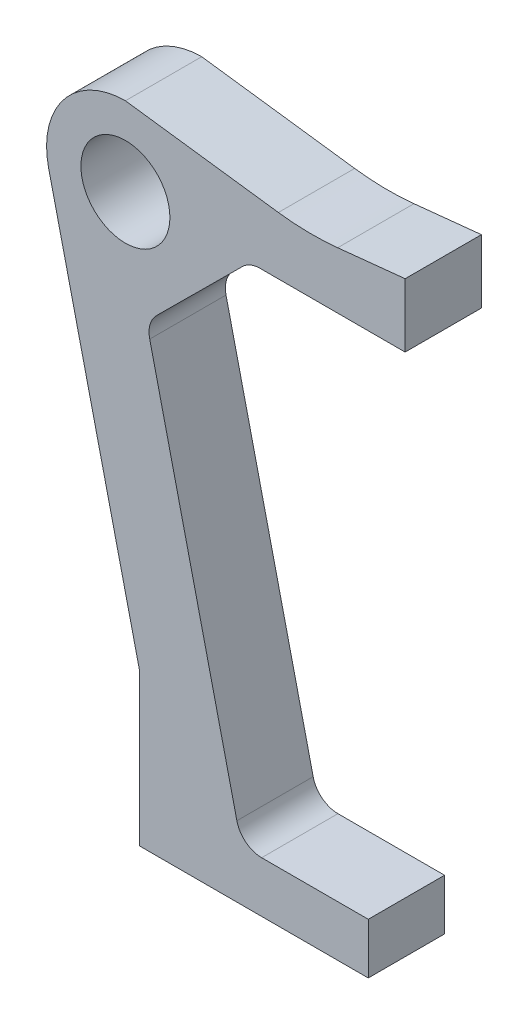
ISO-10303-21;
HEADER;
FILE_DESCRIPTION(('STEP AP214'),'2;1');
FILE_NAME('part.step','',(''),(''),'','','');
FILE_SCHEMA(('AUTOMOTIVE_DESIGN { 1 0 10303 214 1 1 1 1 }'));
ENDSEC;
DATA;
#1=APPLICATION_CONTEXT('core data for automotive mechanical design processes');
#2=APPLICATION_PROTOCOL_DEFINITION('international standard','automotive_design',2000,#1);
#3=PRODUCT_CONTEXT('',#1,'mechanical');
#4=PRODUCT('Part','Part','',(#3));
#5=PRODUCT_RELATED_PRODUCT_CATEGORY('part','',(#4));
#6=PRODUCT_DEFINITION_FORMATION('','',#4);
#7=PRODUCT_DEFINITION_CONTEXT('part definition',#1,'design');
#8=PRODUCT_DEFINITION('design','',#6,#7);
#9=PRODUCT_DEFINITION_SHAPE('','',#8);
#10=(LENGTH_UNIT() NAMED_UNIT(*) SI_UNIT(.MILLI.,.METRE.));
#11=(NAMED_UNIT(*) PLANE_ANGLE_UNIT() SI_UNIT($,.RADIAN.));
#12=(NAMED_UNIT(*) SI_UNIT($,.STERADIAN.) SOLID_ANGLE_UNIT());
#13=UNCERTAINTY_MEASURE_WITH_UNIT(LENGTH_MEASURE(1.E-05),#10,'distance_accuracy_value','');
#14=(GEOMETRIC_REPRESENTATION_CONTEXT(3) GLOBAL_UNCERTAINTY_ASSIGNED_CONTEXT((#13)) GLOBAL_UNIT_ASSIGNED_CONTEXT((#10,
#11,#12)) REPRESENTATION_CONTEXT('',''));
#15=CARTESIAN_POINT('',(0.,0.,0.));
#16=DIRECTION('',(0.,0.,1.));
#17=DIRECTION('',(1.,0.,0.));
#18=AXIS2_PLACEMENT_3D('',#15,#16,#17);
#19=CARTESIAN_POINT('',(9.357429757377,-4.925,3.2));
#20=DIRECTION('',(0.,0.,-1.));
#21=DIRECTION('',(-1.,0.,0.));
#22=AXIS2_PLACEMENT_3D('',#19,#20,#21);
#23=PLANE('',#22);
#24=DIRECTION('',(0.,-1.,0.));
#25=VECTOR('',#24,1.);
#26=CARTESIAN_POINT('',(4.55,-1.925,3.2));
#27=LINE('',#26,#25);
#28=CARTESIAN_POINT('',(4.55,-1.925,3.2));
#29=VERTEX_POINT('',#28);
#30=CARTESIAN_POINT('',(4.55000000000001,-7.925,3.2));
#31=VERTEX_POINT('',#30);
#32=EDGE_CURVE('E215',#29,#31,#27,.T.);
#33=ORIENTED_EDGE('',*,*,#32,.T.);
#34=DIRECTION('',(1.,0.,0.));
#35=VECTOR('',#34,1.);
#36=CARTESIAN_POINT('',(4.55000000000001,-7.925,3.2));
#37=LINE('',#36,#35);
#38=CARTESIAN_POINT('',(13.55,-7.925,3.2));
#39=VERTEX_POINT('',#38);
#40=EDGE_CURVE('E123',#31,#39,#37,.T.);
#41=ORIENTED_EDGE('',*,*,#40,.T.);
#42=DIRECTION('',(0.,1.,0.));
#43=VECTOR('',#42,1.);
#44=CARTESIAN_POINT('',(13.55,-7.925,3.2));
#45=LINE('',#44,#43);
#46=CARTESIAN_POINT('',(13.55,-5.925,3.2));
#47=VERTEX_POINT('',#46);
#48=EDGE_CURVE('E254',#39,#47,#45,.T.);
#49=ORIENTED_EDGE('',*,*,#48,.T.);
#50=DIRECTION('',(-1.,0.,0.));
#51=VECTOR('',#50,1.);
#52=CARTESIAN_POINT('',(13.55,-5.925,3.2));
#53=LINE('',#52,#51);
#54=CARTESIAN_POINT('',(9.357429757377,-5.925,3.2));
#55=VERTEX_POINT('',#54);
#56=EDGE_CURVE('E273',#47,#55,#53,.T.);
#57=ORIENTED_EDGE('',*,*,#56,.T.);
#58=CARTESIAN_POINT('',(9.357429757377,-4.925,3.2));
#59=DIRECTION('',(0.,0.,-1.));
#60=DIRECTION('',(-1.,0.,0.));
#61=AXIS2_PLACEMENT_3D('',#58,#59,#60);
#62=CIRCLE('',#61,1.);
#63=CARTESIAN_POINT('',(8.38358766247106,-5.15222582201239,3.2));
#64=VERTEX_POINT('',#63);
#65=EDGE_CURVE('E270',#55,#64,#62,.T.);
#66=ORIENTED_EDGE('',*,*,#65,.T.);
#67=DIRECTION('',(-0.227225822012392,0.973842094905941,0.));
#68=VECTOR('',#67,1.);
#69=CARTESIAN_POINT('',(8.38358766247106,-5.15222582201239,3.2));
#70=LINE('',#69,#68);
#71=CARTESIAN_POINT('',(4.95620251262334,9.5368262620205,3.2));
#72=VERTEX_POINT('',#71);
#73=EDGE_CURVE('E272',#64,#72,#70,.T.);
#74=ORIENTED_EDGE('',*,*,#73,.T.);
#75=CARTESIAN_POINT('',(5.93004460752928,9.76405208403289,3.2));
#76=DIRECTION('',(0.,0.,-1.));
#77=DIRECTION('',(-1.,0.,0.));
#78=AXIS2_PLACEMENT_3D('',#75,#76,#77);
#79=CIRCLE('',#78,1.);
#80=CARTESIAN_POINT('',(5.22498709725014,10.4732022142585,3.2));
#81=VERTEX_POINT('',#80);
#82=EDGE_CURVE('E275',#72,#81,#79,.T.);
#83=ORIENTED_EDGE('',*,*,#82,.T.);
#84=DIRECTION('',(0.709150130225592,0.705057510279145,0.));
#85=VECTOR('',#84,1.);
#86=CARTESIAN_POINT('',(5.22498709725014,10.4732022142585,3.2));
#87=LINE('',#86,#85);
#88=CARTESIAN_POINT('',(8.59600284324305,13.8247632838806,3.2));
#89=VERTEX_POINT('',#88);
#90=EDGE_CURVE('E281',#81,#89,#87,.T.);
#91=ORIENTED_EDGE('',*,*,#90,.T.);
#92=CARTESIAN_POINT('',(9.3010603535222,13.115613153655,3.2));
#93=DIRECTION('',(0.,0.,-1.));
#94=DIRECTION('',(1.,0.,0.));
#95=AXIS2_PLACEMENT_3D('',#92,#93,#94);
#96=CIRCLE('',#95,1.);
#97=CARTESIAN_POINT('',(9.3010603535222,14.115613153655,3.2));
#98=VERTEX_POINT('',#97);
#99=EDGE_CURVE('E283',#89,#98,#96,.T.);
#100=ORIENTED_EDGE('',*,*,#99,.T.);
#101=DIRECTION('',(1.,0.,0.));
#102=VECTOR('',#101,1.);
#103=CARTESIAN_POINT('',(15.,14.115613153655,3.2));
#104=LINE('',#103,#102);
#105=CARTESIAN_POINT('',(15.,14.115613153655,3.2));
#106=VERTEX_POINT('',#105);
#107=EDGE_CURVE('E285',#98,#106,#104,.T.);
#108=ORIENTED_EDGE('',*,*,#107,.T.);
#109=DIRECTION('',(0.,1.,0.));
#110=VECTOR('',#109,1.);
#111=CARTESIAN_POINT('',(15.,16.615613153655,3.2));
#112=LINE('',#111,#110);
#113=CARTESIAN_POINT('',(15.,16.615613153655,3.2));
#114=VERTEX_POINT('',#113);
#115=EDGE_CURVE('E287',#106,#114,#112,.T.);
#116=ORIENTED_EDGE('',*,*,#115,.T.);
#117=DIRECTION('',(-0.994790734183145,-0.101938192957101,0.));
#118=VECTOR('',#117,1.);
#119=CARTESIAN_POINT('',(15.,16.615613153655,3.2));
#120=LINE('',#119,#118);
#121=CARTESIAN_POINT('',(12.3474469478221,16.3438007457078,3.2));
#122=VERTEX_POINT('',#121);
#123=EDGE_CURVE('E289',#114,#122,#120,.T.);
#124=ORIENTED_EDGE('',*,*,#123,.T.);
#125=CARTESIAN_POINT('',(11.3280650182511,26.2917080875393,3.2));
#126=DIRECTION('',(0.,0.,-1.));
#127=DIRECTION('',(-1.,0.,0.));
#128=AXIS2_PLACEMENT_3D('',#125,#126,#127);
#129=CIRCLE('',#128,10.);
#130=CARTESIAN_POINT('',(10.0149943856032,16.3782906387642,3.2));
#131=VERTEX_POINT('',#130);
#132=EDGE_CURVE('E166',#122,#131,#129,.T.);
#133=ORIENTED_EDGE('',*,*,#132,.T.);
#134=DIRECTION('',(-0.991341744877506,0.131307063264781,0.));
#135=VECTOR('',#134,1.);
#136=CARTESIAN_POINT('',(4.,17.175,3.2));
#137=LINE('',#136,#135);
#138=CARTESIAN_POINT('',(4.,17.175,3.2));
#139=VERTEX_POINT('',#138);
#140=EDGE_CURVE('E160',#131,#139,#137,.T.);
#141=ORIENTED_EDGE('',*,*,#140,.T.);
#142=CARTESIAN_POINT('',(4.,14.075,3.2));
#143=DIRECTION('',(0.,0.,1.));
#144=DIRECTION('',(1.,0.,0.));
#145=AXIS2_PLACEMENT_3D('',#142,#143,#144);
#146=CIRCLE('',#145,3.1);
#147=CARTESIAN_POINT('',(0.981089505791579,13.3705999517616,3.2));
#148=VERTEX_POINT('',#147);
#149=EDGE_CURVE('E164',#139,#148,#146,.T.);
#150=ORIENTED_EDGE('',*,*,#149,.T.);
#151=DIRECTION('',(0.227225822012392,-0.973842094905941,0.));
#152=VECTOR('',#151,1.);
#153=CARTESIAN_POINT('',(0.981089505791579,13.3705999517616,3.2));
#154=LINE('',#153,#152);
#155=EDGE_CURVE('E56',#148,#29,#154,.T.);
#156=ORIENTED_EDGE('',*,*,#155,.T.);
#157=EDGE_LOOP('',(#33,#41,#49,#57,#66,#74,#83,#91,#100,#108,#116,#124,#133,#141,#150,#156));
#158=FACE_BOUND('',#157,.T.);
#159=CARTESIAN_POINT('',(4.,14.075,3.2));
#160=DIRECTION('',(0.,0.,1.));
#161=DIRECTION('',(1.,0.,0.));
#162=AXIS2_PLACEMENT_3D('',#159,#160,#161);
#163=CIRCLE('',#162,1.75);
#164=CARTESIAN_POINT('',(5.75,14.075,3.2));
#165=VERTEX_POINT('',#164);
#166=EDGE_CURVE('E188',#165,#165,#163,.T.);
#167=ORIENTED_EDGE('',*,*,#166,.F.);
#168=EDGE_LOOP('',(#167));
#169=FACE_BOUND('',#168,.T.);
#170=ADVANCED_FACE('F39',(#158,#169),#23,.F.);
#171=CARTESIAN_POINT('',(9.357429757377,-4.925,0.2));
#172=DIRECTION('',(0.,0.,-1.));
#173=DIRECTION('',(-1.,0.,0.));
#174=AXIS2_PLACEMENT_3D('',#171,#172,#173);
#175=PLANE('',#174);
#176=DIRECTION('',(0.,-1.,0.));
#177=VECTOR('',#176,1.);
#178=CARTESIAN_POINT('',(4.55,-1.925,0.2));
#179=LINE('',#178,#177);
#180=CARTESIAN_POINT('',(4.55,-1.925,0.2));
#181=VERTEX_POINT('',#180);
#182=CARTESIAN_POINT('',(4.55000000000001,-7.925,0.2));
#183=VERTEX_POINT('',#182);
#184=EDGE_CURVE('E184',#181,#183,#179,.T.);
#185=ORIENTED_EDGE('',*,*,#184,.F.);
#186=DIRECTION('',(0.227225822012392,-0.973842094905941,0.));
#187=VECTOR('',#186,1.);
#188=CARTESIAN_POINT('',(0.981089505791579,13.3705999517616,0.2));
#189=LINE('',#188,#187);
#190=CARTESIAN_POINT('',(0.981089505791579,13.3705999517616,0.2));
#191=VERTEX_POINT('',#190);
#192=EDGE_CURVE('E115',#191,#181,#189,.T.);
#193=ORIENTED_EDGE('',*,*,#192,.F.);
#194=CARTESIAN_POINT('',(4.,14.075,0.2));
#195=DIRECTION('',(0.,0.,1.));
#196=DIRECTION('',(1.,0.,0.));
#197=AXIS2_PLACEMENT_3D('',#194,#195,#196);
#198=CIRCLE('',#197,3.1);
#199=CARTESIAN_POINT('',(4.,17.175,0.2));
#200=VERTEX_POINT('',#199);
#201=EDGE_CURVE('E109',#200,#191,#198,.T.);
#202=ORIENTED_EDGE('',*,*,#201,.F.);
#203=DIRECTION('',(-0.991341744877506,0.131307063264781,0.));
#204=VECTOR('',#203,1.);
#205=CARTESIAN_POINT('',(4.,17.175,0.2));
#206=LINE('',#205,#204);
#207=CARTESIAN_POINT('',(10.0149943856032,16.3782906387642,0.2));
#208=VERTEX_POINT('',#207);
#209=EDGE_CURVE('E174',#208,#200,#206,.T.);
#210=ORIENTED_EDGE('',*,*,#209,.F.);
#211=CARTESIAN_POINT('',(11.3280650182511,26.2917080875393,0.2));
#212=DIRECTION('',(0.,0.,-1.));
#213=DIRECTION('',(-1.,0.,0.));
#214=AXIS2_PLACEMENT_3D('',#211,#212,#213);
#215=CIRCLE('',#214,10.);
#216=CARTESIAN_POINT('',(12.3474469478221,16.3438007457078,0.2));
#217=VERTEX_POINT('',#216);
#218=EDGE_CURVE('E210',#217,#208,#215,.T.);
#219=ORIENTED_EDGE('',*,*,#218,.F.);
#220=DIRECTION('',(-0.994790734183145,-0.101938192957101,0.));
#221=VECTOR('',#220,1.);
#222=CARTESIAN_POINT('',(15.,16.615613153655,0.2));
#223=LINE('',#222,#221);
#224=CARTESIAN_POINT('',(15.,16.615613153655,0.2));
#225=VERTEX_POINT('',#224);
#226=EDGE_CURVE('E208',#225,#217,#223,.T.);
#227=ORIENTED_EDGE('',*,*,#226,.F.);
#228=DIRECTION('',(0.,1.,0.));
#229=VECTOR('',#228,1.);
#230=CARTESIAN_POINT('',(15.,16.615613153655,0.2));
#231=LINE('',#230,#229);
#232=CARTESIAN_POINT('',(15.,14.115613153655,0.2));
#233=VERTEX_POINT('',#232);
#234=EDGE_CURVE('E206',#233,#225,#231,.T.);
#235=ORIENTED_EDGE('',*,*,#234,.F.);
#236=DIRECTION('',(1.,0.,0.));
#237=VECTOR('',#236,1.);
#238=CARTESIAN_POINT('',(15.,14.115613153655,0.2));
#239=LINE('',#238,#237);
#240=CARTESIAN_POINT('',(9.3010603535222,14.115613153655,0.2));
#241=VERTEX_POINT('',#240);
#242=EDGE_CURVE('E204',#241,#233,#239,.T.);
#243=ORIENTED_EDGE('',*,*,#242,.F.);
#244=CARTESIAN_POINT('',(9.3010603535222,13.115613153655,0.2));
#245=DIRECTION('',(0.,0.,-1.));
#246=DIRECTION('',(1.,0.,0.));
#247=AXIS2_PLACEMENT_3D('',#244,#245,#246);
#248=CIRCLE('',#247,1.);
#249=CARTESIAN_POINT('',(8.59600284324305,13.8247632838806,0.2));
#250=VERTEX_POINT('',#249);
#251=EDGE_CURVE('E202',#250,#241,#248,.T.);
#252=ORIENTED_EDGE('',*,*,#251,.F.);
#253=DIRECTION('',(0.709150130225592,0.705057510279145,0.));
#254=VECTOR('',#253,1.);
#255=CARTESIAN_POINT('',(5.22498709725014,10.4732022142585,0.2));
#256=LINE('',#255,#254);
#257=CARTESIAN_POINT('',(5.22498709725014,10.4732022142585,0.2));
#258=VERTEX_POINT('',#257);
#259=EDGE_CURVE('E200',#258,#250,#256,.T.);
#260=ORIENTED_EDGE('',*,*,#259,.F.);
#261=CARTESIAN_POINT('',(5.93004460752928,9.76405208403289,0.2));
#262=DIRECTION('',(0.,0.,-1.));
#263=DIRECTION('',(-1.,0.,0.));
#264=AXIS2_PLACEMENT_3D('',#261,#262,#263);
#265=CIRCLE('',#264,1.);
#266=CARTESIAN_POINT('',(4.95620251262334,9.5368262620205,0.2));
#267=VERTEX_POINT('',#266);
#268=EDGE_CURVE('E198',#267,#258,#265,.T.);
#269=ORIENTED_EDGE('',*,*,#268,.F.);
#270=DIRECTION('',(-0.227225822012392,0.973842094905941,0.));
#271=VECTOR('',#270,1.);
#272=CARTESIAN_POINT('',(8.38358766247106,-5.15222582201239,0.2));
#273=LINE('',#272,#271);
#274=CARTESIAN_POINT('',(8.38358766247106,-5.15222582201239,0.2));
#275=VERTEX_POINT('',#274);
#276=EDGE_CURVE('E196',#275,#267,#273,.T.);
#277=ORIENTED_EDGE('',*,*,#276,.F.);
#278=CARTESIAN_POINT('',(9.357429757377,-4.925,0.2));
#279=DIRECTION('',(0.,0.,-1.));
#280=DIRECTION('',(-1.,0.,0.));
#281=AXIS2_PLACEMENT_3D('',#278,#279,#280);
#282=CIRCLE('',#281,1.);
#283=CARTESIAN_POINT('',(9.357429757377,-5.925,0.2));
#284=VERTEX_POINT('',#283);
#285=EDGE_CURVE('E194',#284,#275,#282,.T.);
#286=ORIENTED_EDGE('',*,*,#285,.F.);
#287=DIRECTION('',(-1.,0.,0.));
#288=VECTOR('',#287,1.);
#289=CARTESIAN_POINT('',(13.55,-5.925,0.2));
#290=LINE('',#289,#288);
#291=CARTESIAN_POINT('',(13.55,-5.925,0.2));
#292=VERTEX_POINT('',#291);
#293=EDGE_CURVE('E192',#292,#284,#290,.T.);
#294=ORIENTED_EDGE('',*,*,#293,.F.);
#295=DIRECTION('',(0.,1.,0.));
#296=VECTOR('',#295,1.);
#297=CARTESIAN_POINT('',(13.55,-7.925,0.2));
#298=LINE('',#297,#296);
#299=CARTESIAN_POINT('',(13.55,-7.925,0.2));
#300=VERTEX_POINT('',#299);
#301=EDGE_CURVE('E190',#300,#292,#298,.T.);
#302=ORIENTED_EDGE('',*,*,#301,.F.);
#303=DIRECTION('',(1.,0.,0.));
#304=VECTOR('',#303,1.);
#305=CARTESIAN_POINT('',(4.55000000000001,-7.925,0.2));
#306=LINE('',#305,#304);
#307=EDGE_CURVE('E187',#183,#300,#306,.T.);
#308=ORIENTED_EDGE('',*,*,#307,.F.);
#309=EDGE_LOOP('',(#185,#193,#202,#210,#219,#227,#235,#243,#252,#260,#269,#277,#286,#294,#302,#308));
#310=FACE_BOUND('',#309,.T.);
#311=CARTESIAN_POINT('',(4.,14.075,0.2));
#312=DIRECTION('',(0.,0.,1.));
#313=DIRECTION('',(1.,0.,0.));
#314=AXIS2_PLACEMENT_3D('',#311,#312,#313);
#315=CIRCLE('',#314,1.75);
#316=CARTESIAN_POINT('',(5.75,14.075,0.2));
#317=VERTEX_POINT('',#316);
#318=EDGE_CURVE('E488',#317,#317,#315,.T.);
#319=ORIENTED_EDGE('',*,*,#318,.T.);
#320=EDGE_LOOP('',(#319));
#321=FACE_BOUND('',#320,.T.);
#322=ADVANCED_FACE('F258',(#310,#321),#175,.T.);
#323=CARTESIAN_POINT('',(4.55,-1.925,3.2));
#324=DIRECTION('',(1.,0.,0.));
#325=DIRECTION('',(0.,1.,0.));
#326=AXIS2_PLACEMENT_3D('',#323,#324,#325);
#327=PLANE('',#326);
#328=ORIENTED_EDGE('',*,*,#184,.T.);
#329=DIRECTION('',(0.,0.,-1.));
#330=VECTOR('',#329,1.);
#331=CARTESIAN_POINT('',(4.55000000000001,-7.925,3.2));
#332=LINE('',#331,#330);
#333=EDGE_CURVE('E11',#31,#183,#332,.T.);
#334=ORIENTED_EDGE('',*,*,#333,.F.);
#335=ORIENTED_EDGE('',*,*,#32,.F.);
#336=DIRECTION('',(0.,0.,-1.));
#337=VECTOR('',#336,1.);
#338=CARTESIAN_POINT('',(4.55,-1.925,3.2));
#339=LINE('',#338,#337);
#340=EDGE_CURVE('E180',#29,#181,#339,.T.);
#341=ORIENTED_EDGE('',*,*,#340,.T.);
#342=EDGE_LOOP('',(#328,#334,#335,#341));
#343=FACE_BOUND('',#342,.T.);
#344=ADVANCED_FACE('F41',(#343),#327,.F.);
#345=CARTESIAN_POINT('',(4.55000000000001,-7.925,3.2));
#346=DIRECTION('',(0.,1.,0.));
#347=DIRECTION('',(0.,0.,1.));
#348=AXIS2_PLACEMENT_3D('',#345,#346,#347);
#349=PLANE('',#348);
#350=ORIENTED_EDGE('',*,*,#307,.T.);
#351=DIRECTION('',(0.,0.,-1.));
#352=VECTOR('',#351,1.);
#353=CARTESIAN_POINT('',(13.55,-7.925,3.2));
#354=LINE('',#353,#352);
#355=EDGE_CURVE('E48',#39,#300,#354,.T.);
#356=ORIENTED_EDGE('',*,*,#355,.F.);
#357=ORIENTED_EDGE('',*,*,#40,.F.);
#358=ORIENTED_EDGE('',*,*,#333,.T.);
#359=EDGE_LOOP('',(#350,#356,#357,#358));
#360=FACE_BOUND('',#359,.T.);
#361=ADVANCED_FACE('F323',(#360),#349,.F.);
#362=CARTESIAN_POINT('',(13.55,-7.925,3.2));
#363=DIRECTION('',(-1.,0.,0.));
#364=DIRECTION('',(0.,0.,1.));
#365=AXIS2_PLACEMENT_3D('',#362,#363,#364);
#366=PLANE('',#365);
#367=ORIENTED_EDGE('',*,*,#301,.T.);
#368=DIRECTION('',(0.,0.,-1.));
#369=VECTOR('',#368,1.);
#370=CARTESIAN_POINT('',(13.55,-5.925,3.2));
#371=LINE('',#370,#369);
#372=EDGE_CURVE('E246',#47,#292,#371,.T.);
#373=ORIENTED_EDGE('',*,*,#372,.F.);
#374=ORIENTED_EDGE('',*,*,#48,.F.);
#375=ORIENTED_EDGE('',*,*,#355,.T.);
#376=EDGE_LOOP('',(#367,#373,#374,#375));
#377=FACE_BOUND('',#376,.T.);
#378=ADVANCED_FACE('F252',(#377),#366,.F.);
#379=CARTESIAN_POINT('',(13.55,-5.925,3.2));
#380=DIRECTION('',(0.,-1.,0.));
#381=DIRECTION('',(0.,0.,-1.));
#382=AXIS2_PLACEMENT_3D('',#379,#380,#381);
#383=PLANE('',#382);
#384=ORIENTED_EDGE('',*,*,#293,.T.);
#385=DIRECTION('',(0.,0.,-1.));
#386=VECTOR('',#385,1.);
#387=CARTESIAN_POINT('',(9.357429757377,-5.925,3.2));
#388=LINE('',#387,#386);
#389=EDGE_CURVE('E243',#55,#284,#388,.T.);
#390=ORIENTED_EDGE('',*,*,#389,.F.);
#391=ORIENTED_EDGE('',*,*,#56,.F.);
#392=ORIENTED_EDGE('',*,*,#372,.T.);
#393=EDGE_LOOP('',(#384,#390,#391,#392));
#394=FACE_BOUND('',#393,.T.);
#395=ADVANCED_FACE('F264',(#394),#383,.F.);
#396=CARTESIAN_POINT('',(9.357429757377,-4.925,3.2));
#397=DIRECTION('',(0.,0.,-1.));
#398=DIRECTION('',(-1.,0.,0.));
#399=AXIS2_PLACEMENT_3D('',#396,#397,#398);
#400=CYLINDRICAL_SURFACE('',#399,1.);
#401=ORIENTED_EDGE('',*,*,#285,.T.);
#402=DIRECTION('',(0.,0.,-1.));
#403=VECTOR('',#402,1.);
#404=CARTESIAN_POINT('',(8.38358766247106,-5.15222582201239,3.2));
#405=LINE('',#404,#403);
#406=EDGE_CURVE('E240',#64,#275,#405,.T.);
#407=ORIENTED_EDGE('',*,*,#406,.F.);
#408=ORIENTED_EDGE('',*,*,#65,.F.);
#409=ORIENTED_EDGE('',*,*,#389,.T.);
#410=EDGE_LOOP('',(#401,#407,#408,#409));
#411=FACE_BOUND('',#410,.T.);
#412=ADVANCED_FACE('F268',(#411),#400,.F.);
#413=CARTESIAN_POINT('',(8.38358766247106,-5.15222582201239,3.2));
#414=DIRECTION('',(-0.973842094905942,-0.227225822012392,0.));
#415=DIRECTION('',(0.227225822012392,-0.973842094905942,0.));
#416=AXIS2_PLACEMENT_3D('',#413,#414,#415);
#417=PLANE('',#416);
#418=ORIENTED_EDGE('',*,*,#276,.T.);
#419=DIRECTION('',(0.,0.,-1.));
#420=VECTOR('',#419,1.);
#421=CARTESIAN_POINT('',(4.95620251262334,9.5368262620205,3.2));
#422=LINE('',#421,#420);
#423=EDGE_CURVE('E237',#72,#267,#422,.T.);
#424=ORIENTED_EDGE('',*,*,#423,.F.);
#425=ORIENTED_EDGE('',*,*,#73,.F.);
#426=ORIENTED_EDGE('',*,*,#406,.T.);
#427=EDGE_LOOP('',(#418,#424,#425,#426));
#428=FACE_BOUND('',#427,.T.);
#429=ADVANCED_FACE('F336',(#428),#417,.F.);
#430=CARTESIAN_POINT('',(5.93004460752928,9.76405208403289,3.2));
#431=DIRECTION('',(0.,0.,-1.));
#432=DIRECTION('',(-1.,0.,0.));
#433=AXIS2_PLACEMENT_3D('',#430,#431,#432);
#434=CYLINDRICAL_SURFACE('',#433,1.);
#435=ORIENTED_EDGE('',*,*,#268,.T.);
#436=DIRECTION('',(0.,0.,-1.));
#437=VECTOR('',#436,1.);
#438=CARTESIAN_POINT('',(5.22498709725014,10.4732022142585,3.2));
#439=LINE('',#438,#437);
#440=EDGE_CURVE('E234',#81,#258,#439,.T.);
#441=ORIENTED_EDGE('',*,*,#440,.F.);
#442=ORIENTED_EDGE('',*,*,#82,.F.);
#443=ORIENTED_EDGE('',*,*,#423,.T.);
#444=EDGE_LOOP('',(#435,#441,#442,#443));
#445=FACE_BOUND('',#444,.T.);
#446=ADVANCED_FACE('F339',(#445),#434,.F.);
#447=CARTESIAN_POINT('',(5.22498709725014,10.4732022142585,3.2));
#448=DIRECTION('',(-0.705057510279145,0.709150130225592,0.));
#449=DIRECTION('',(-0.709150130225592,-0.705057510279145,0.));
#450=AXIS2_PLACEMENT_3D('',#447,#448,#449);
#451=PLANE('',#450);
#452=ORIENTED_EDGE('',*,*,#259,.T.);
#453=DIRECTION('',(0.,0.,-1.));
#454=VECTOR('',#453,1.);
#455=CARTESIAN_POINT('',(8.59600284324305,13.8247632838806,3.2));
#456=LINE('',#455,#454);
#457=EDGE_CURVE('E231',#89,#250,#456,.T.);
#458=ORIENTED_EDGE('',*,*,#457,.F.);
#459=ORIENTED_EDGE('',*,*,#90,.F.);
#460=ORIENTED_EDGE('',*,*,#440,.T.);
#461=EDGE_LOOP('',(#452,#458,#459,#460));
#462=FACE_BOUND('',#461,.T.);
#463=ADVANCED_FACE('F343',(#462),#451,.F.);
#464=CARTESIAN_POINT('',(9.3010603535222,13.115613153655,3.2));
#465=DIRECTION('',(0.,0.,-1.));
#466=DIRECTION('',(-1.,0.,0.));
#467=AXIS2_PLACEMENT_3D('',#464,#465,#466);
#468=CYLINDRICAL_SURFACE('',#467,1.);
#469=ORIENTED_EDGE('',*,*,#251,.T.);
#470=DIRECTION('',(0.,0.,-1.));
#471=VECTOR('',#470,1.);
#472=CARTESIAN_POINT('',(9.3010603535222,14.115613153655,3.2));
#473=LINE('',#472,#471);
#474=EDGE_CURVE('E228',#98,#241,#473,.T.);
#475=ORIENTED_EDGE('',*,*,#474,.F.);
#476=ORIENTED_EDGE('',*,*,#99,.F.);
#477=ORIENTED_EDGE('',*,*,#457,.T.);
#478=EDGE_LOOP('',(#469,#475,#476,#477));
#479=FACE_BOUND('',#478,.T.);
#480=ADVANCED_FACE('F347',(#479),#468,.F.);
#481=CARTESIAN_POINT('',(15.,14.115613153655,3.2));
#482=DIRECTION('',(0.,1.,0.));
#483=DIRECTION('',(-1.,0.,0.));
#484=AXIS2_PLACEMENT_3D('',#481,#482,#483);
#485=PLANE('',#484);
#486=ORIENTED_EDGE('',*,*,#242,.T.);
#487=DIRECTION('',(0.,0.,-1.));
#488=VECTOR('',#487,1.);
#489=CARTESIAN_POINT('',(15.,14.115613153655,3.2));
#490=LINE('',#489,#488);
#491=EDGE_CURVE('E225',#106,#233,#490,.T.);
#492=ORIENTED_EDGE('',*,*,#491,.F.);
#493=ORIENTED_EDGE('',*,*,#107,.F.);
#494=ORIENTED_EDGE('',*,*,#474,.T.);
#495=EDGE_LOOP('',(#486,#492,#493,#494));
#496=FACE_BOUND('',#495,.T.);
#497=ADVANCED_FACE('F351',(#496),#485,.F.);
#498=CARTESIAN_POINT('',(15.,16.615613153655,3.2));
#499=DIRECTION('',(-1.,0.,0.));
#500=DIRECTION('',(0.,0.,1.));
#501=AXIS2_PLACEMENT_3D('',#498,#499,#500);
#502=PLANE('',#501);
#503=ORIENTED_EDGE('',*,*,#234,.T.);
#504=DIRECTION('',(0.,0.,-1.));
#505=VECTOR('',#504,1.);
#506=CARTESIAN_POINT('',(15.,16.615613153655,3.2));
#507=LINE('',#506,#505);
#508=EDGE_CURVE('E222',#114,#225,#507,.T.);
#509=ORIENTED_EDGE('',*,*,#508,.F.);
#510=ORIENTED_EDGE('',*,*,#115,.F.);
#511=ORIENTED_EDGE('',*,*,#491,.T.);
#512=EDGE_LOOP('',(#503,#509,#510,#511));
#513=FACE_BOUND('',#512,.T.);
#514=ADVANCED_FACE('F355',(#513),#502,.F.);
#515=CARTESIAN_POINT('',(15.,16.615613153655,3.2));
#516=DIRECTION('',(0.101938192957101,-0.994790734183145,0.));
#517=DIRECTION('',(0.994790734183145,0.101938192957101,0.));
#518=AXIS2_PLACEMENT_3D('',#515,#516,#517);
#519=PLANE('',#518);
#520=ORIENTED_EDGE('',*,*,#226,.T.);
#521=DIRECTION('',(0.,0.,-1.));
#522=VECTOR('',#521,1.);
#523=CARTESIAN_POINT('',(12.3474469478221,16.3438007457078,3.2));
#524=LINE('',#523,#522);
#525=EDGE_CURVE('E219',#122,#217,#524,.T.);
#526=ORIENTED_EDGE('',*,*,#525,.F.);
#527=ORIENTED_EDGE('',*,*,#123,.F.);
#528=ORIENTED_EDGE('',*,*,#508,.T.);
#529=EDGE_LOOP('',(#520,#526,#527,#528));
#530=FACE_BOUND('',#529,.T.);
#531=ADVANCED_FACE('F295',(#530),#519,.F.);
#532=CARTESIAN_POINT('',(11.3280650182511,26.2917080875393,3.2));
#533=DIRECTION('',(0.,0.,-1.));
#534=DIRECTION('',(-1.,0.,0.));
#535=AXIS2_PLACEMENT_3D('',#532,#533,#534);
#536=CYLINDRICAL_SURFACE('',#535,10.);
#537=ORIENTED_EDGE('',*,*,#218,.T.);
#538=DIRECTION('',(0.,0.,-1.));
#539=VECTOR('',#538,1.);
#540=CARTESIAN_POINT('',(10.0149943856032,16.3782906387642,3.2));
#541=LINE('',#540,#539);
#542=EDGE_CURVE('E175',#131,#208,#541,.T.);
#543=ORIENTED_EDGE('',*,*,#542,.F.);
#544=ORIENTED_EDGE('',*,*,#132,.F.);
#545=ORIENTED_EDGE('',*,*,#525,.T.);
#546=EDGE_LOOP('',(#537,#543,#544,#545));
#547=FACE_BOUND('',#546,.T.);
#548=ADVANCED_FACE('F299',(#547),#536,.F.);
#549=CARTESIAN_POINT('',(4.,17.175,3.2));
#550=DIRECTION('',(-0.131307063264781,-0.991341744877506,0.));
#551=DIRECTION('',(0.991341744877506,-0.131307063264781,0.));
#552=AXIS2_PLACEMENT_3D('',#549,#550,#551);
#553=PLANE('',#552);
#554=ORIENTED_EDGE('',*,*,#209,.T.);
#555=DIRECTION('',(0.,0.,-1.));
#556=VECTOR('',#555,1.);
#557=CARTESIAN_POINT('',(4.,17.175,3.2));
#558=LINE('',#557,#556);
#559=EDGE_CURVE('E171',#139,#200,#558,.T.);
#560=ORIENTED_EDGE('',*,*,#559,.F.);
#561=ORIENTED_EDGE('',*,*,#140,.F.);
#562=ORIENTED_EDGE('',*,*,#542,.T.);
#563=EDGE_LOOP('',(#554,#560,#561,#562));
#564=FACE_BOUND('',#563,.T.);
#565=ADVANCED_FACE('F172',(#564),#553,.F.);
#566=CARTESIAN_POINT('',(4.,14.075,3.2));
#567=DIRECTION('',(0.,0.,-1.));
#568=DIRECTION('',(-1.,0.,0.));
#569=AXIS2_PLACEMENT_3D('',#566,#567,#568);
#570=CYLINDRICAL_SURFACE('',#569,3.1);
#571=ORIENTED_EDGE('',*,*,#201,.T.);
#572=DIRECTION('',(0.,0.,-1.));
#573=VECTOR('',#572,1.);
#574=CARTESIAN_POINT('',(0.981089505791579,13.3705999517616,3.2));
#575=LINE('',#574,#573);
#576=EDGE_CURVE('E176',#148,#191,#575,.T.);
#577=ORIENTED_EDGE('',*,*,#576,.F.);
#578=ORIENTED_EDGE('',*,*,#149,.F.);
#579=ORIENTED_EDGE('',*,*,#559,.T.);
#580=EDGE_LOOP('',(#571,#577,#578,#579));
#581=FACE_BOUND('',#580,.T.);
#582=ADVANCED_FACE('F178',(#581),#570,.T.);
#583=CARTESIAN_POINT('',(0.981089505791579,13.3705999517616,3.2));
#584=DIRECTION('',(0.973842094905942,0.227225822012392,0.));
#585=DIRECTION('',(-0.227225822012392,0.973842094905942,0.));
#586=AXIS2_PLACEMENT_3D('',#583,#584,#585);
#587=PLANE('',#586);
#588=ORIENTED_EDGE('',*,*,#192,.T.);
#589=ORIENTED_EDGE('',*,*,#340,.F.);
#590=ORIENTED_EDGE('',*,*,#155,.F.);
#591=ORIENTED_EDGE('',*,*,#576,.T.);
#592=EDGE_LOOP('',(#588,#589,#590,#591));
#593=FACE_BOUND('',#592,.T.);
#594=ADVANCED_FACE('F303',(#593),#587,.F.);
#595=CARTESIAN_POINT('',(4.,14.075,3.2));
#596=DIRECTION('',(0.,0.,-1.));
#597=DIRECTION('',(-1.,0.,0.));
#598=AXIS2_PLACEMENT_3D('',#595,#596,#597);
#599=CYLINDRICAL_SURFACE('',#598,1.75);
#600=ORIENTED_EDGE('',*,*,#166,.T.);
#601=EDGE_LOOP('',(#600));
#602=FACE_BOUND('',#601,.T.);
#603=ORIENTED_EDGE('',*,*,#318,.F.);
#604=EDGE_LOOP('',(#603));
#605=FACE_BOUND('',#604,.T.);
#606=ADVANCED_FACE('F305',(#602,#605),#599,.F.);
#607=CLOSED_SHELL('',(#170,#322,#344,#361,#378,#395,#412,#429,#446,#463,#480,#497,#514,#531,
#548,#565,#582,#594,#606));
#608=MANIFOLD_SOLID_BREP('B2',#607);
#609=ADVANCED_BREP_SHAPE_REPRESENTATION('',(#18,#608),#14);
#610=SHAPE_DEFINITION_REPRESENTATION(#9,#609);
ENDSEC;
END-ISO-10303-21;
